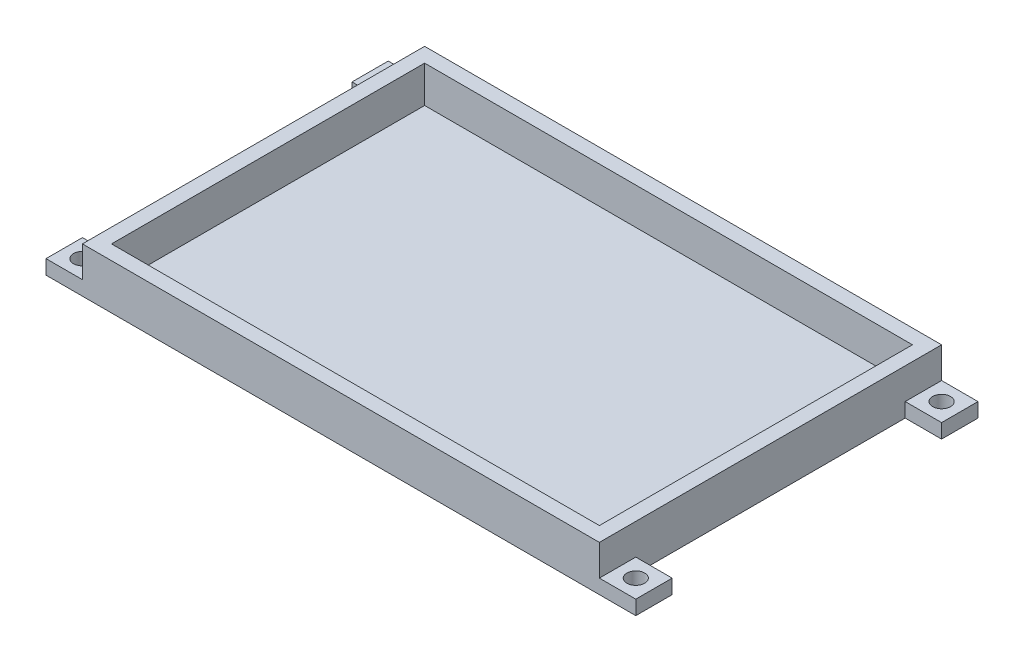
ISO-10303-21;
HEADER;
FILE_DESCRIPTION(('STEP AP214'),'2;1');
FILE_NAME('part.step','',(''),(''),'','','');
FILE_SCHEMA(('AUTOMOTIVE_DESIGN { 1 0 10303 214 1 1 1 1 }'));
ENDSEC;
DATA;
#1=APPLICATION_CONTEXT('core data for automotive mechanical design processes');
#2=APPLICATION_PROTOCOL_DEFINITION('international standard','automotive_design',2000,#1);
#3=PRODUCT_CONTEXT('',#1,'mechanical');
#4=PRODUCT('Part','Part','',(#3));
#5=PRODUCT_RELATED_PRODUCT_CATEGORY('part','',(#4));
#6=PRODUCT_DEFINITION_FORMATION('','',#4);
#7=PRODUCT_DEFINITION_CONTEXT('part definition',#1,'design');
#8=PRODUCT_DEFINITION('design','',#6,#7);
#9=PRODUCT_DEFINITION_SHAPE('','',#8);
#10=(LENGTH_UNIT() NAMED_UNIT(*) SI_UNIT(.MILLI.,.METRE.));
#11=(NAMED_UNIT(*) PLANE_ANGLE_UNIT() SI_UNIT($,.RADIAN.));
#12=(NAMED_UNIT(*) SI_UNIT($,.STERADIAN.) SOLID_ANGLE_UNIT());
#13=UNCERTAINTY_MEASURE_WITH_UNIT(LENGTH_MEASURE(1.E-05),#10,'distance_accuracy_value','');
#14=(GEOMETRIC_REPRESENTATION_CONTEXT(3) GLOBAL_UNCERTAINTY_ASSIGNED_CONTEXT((#13)) GLOBAL_UNIT_ASSIGNED_CONTEXT((#10,
#11,#12)) REPRESENTATION_CONTEXT('',''));
#15=CARTESIAN_POINT('',(0.,0.,0.));
#16=DIRECTION('',(0.,0.,1.));
#17=DIRECTION('',(1.,0.,0.));
#18=AXIS2_PLACEMENT_3D('',#15,#16,#17);
#19=CARTESIAN_POINT('',(96.5200042724609,1.5,0.));
#20=DIRECTION('',(-1.,0.,0.));
#21=DIRECTION('',(0.,0.,1.));
#22=AXIS2_PLACEMENT_3D('',#19,#20,#21);
#23=PLANE('',#22);
#24=DIRECTION('',(0.,-1.,0.));
#25=VECTOR('',#24,1.);
#26=CARTESIAN_POINT('',(96.5200042724609,2.5,6.34999942779541));
#27=LINE('',#26,#25);
#28=CARTESIAN_POINT('',(96.5200042724609,2.5,6.34999942779541));
#29=VERTEX_POINT('',#28);
#30=CARTESIAN_POINT('',(96.5200042724609,0.,6.34999942779541));
#31=VERTEX_POINT('',#30);
#32=EDGE_CURVE('E54',#29,#31,#27,.T.);
#33=ORIENTED_EDGE('',*,*,#32,.F.);
#34=DIRECTION('',(0.,0.,1.));
#35=VECTOR('',#34,1.);
#36=CARTESIAN_POINT('',(96.5200042724609,2.5,6.34999942779541));
#37=LINE('',#36,#35);
#38=CARTESIAN_POINT('',(96.5200042724609,2.5,0.));
#39=VERTEX_POINT('',#38);
#40=EDGE_CURVE('E58',#39,#29,#37,.T.);
#41=ORIENTED_EDGE('',*,*,#40,.F.);
#42=DIRECTION('',(0.,-1.,0.));
#43=VECTOR('',#42,1.);
#44=CARTESIAN_POINT('',(96.5200042724609,1.5,0.));
#45=LINE('',#44,#43);
#46=CARTESIAN_POINT('',(96.5200042724609,7.9,0.));
#47=VERTEX_POINT('',#46);
#48=EDGE_CURVE('E181',#47,#39,#45,.T.);
#49=ORIENTED_EDGE('',*,*,#48,.F.);
#50=DIRECTION('',(0.,0.,-1.));
#51=VECTOR('',#50,1.);
#52=CARTESIAN_POINT('',(96.5200042724609,7.9,0.));
#53=LINE('',#52,#51);
#54=CARTESIAN_POINT('',(96.5200042724609,7.9,59.689998626709));
#55=VERTEX_POINT('',#54);
#56=EDGE_CURVE('E327',#55,#47,#53,.T.);
#57=ORIENTED_EDGE('',*,*,#56,.F.);
#58=DIRECTION('',(0.,-1.,0.));
#59=VECTOR('',#58,1.);
#60=CARTESIAN_POINT('',(96.5200042724609,1.5,59.689998626709));
#61=LINE('',#60,#59);
#62=CARTESIAN_POINT('',(96.5200042724609,2.5,59.689998626709));
#63=VERTEX_POINT('',#62);
#64=EDGE_CURVE('E47',#55,#63,#61,.T.);
#65=ORIENTED_EDGE('',*,*,#64,.T.);
#66=DIRECTION('',(0.,0.,1.));
#67=VECTOR('',#66,1.);
#68=CARTESIAN_POINT('',(96.5200042724609,2.5,59.689998626709));
#69=LINE('',#68,#67);
#70=CARTESIAN_POINT('',(96.5200042724609,2.5,53.3400001525879));
#71=VERTEX_POINT('',#70);
#72=EDGE_CURVE('E216',#71,#63,#69,.T.);
#73=ORIENTED_EDGE('',*,*,#72,.F.);
#74=DIRECTION('',(0.,-1.,0.));
#75=VECTOR('',#74,1.);
#76=CARTESIAN_POINT('',(96.5200042724609,2.5,53.3400001525879));
#77=LINE('',#76,#75);
#78=CARTESIAN_POINT('',(96.5200042724609,0.,53.3400001525879));
#79=VERTEX_POINT('',#78);
#80=EDGE_CURVE('E226',#71,#79,#77,.T.);
#81=ORIENTED_EDGE('',*,*,#80,.T.);
#82=DIRECTION('',(0.,0.,-1.));
#83=VECTOR('',#82,1.);
#84=CARTESIAN_POINT('',(96.5200042724609,0.,0.));
#85=LINE('',#84,#83);
#86=EDGE_CURVE('E337',#79,#31,#85,.T.);
#87=ORIENTED_EDGE('',*,*,#86,.T.);
#88=EDGE_LOOP('',(#33,#41,#49,#57,#65,#73,#81,#87));
#89=FACE_BOUND('',#88,.T.);
#90=ADVANCED_FACE('F39',(#89),#23,.F.);
#91=CARTESIAN_POINT('',(6.35000038146973,1.5,0.));
#92=DIRECTION('',(1.,0.,0.));
#93=DIRECTION('',(0.,0.,-1.));
#94=AXIS2_PLACEMENT_3D('',#91,#92,#93);
#95=PLANE('',#94);
#96=DIRECTION('',(0.,-1.,0.));
#97=VECTOR('',#96,1.);
#98=CARTESIAN_POINT('',(6.35000038146973,2.5,53.3400001525879));
#99=LINE('',#98,#97);
#100=CARTESIAN_POINT('',(6.35000038146973,2.5,53.3400001525879));
#101=VERTEX_POINT('',#100);
#102=CARTESIAN_POINT('',(6.35000038146973,0.,53.3400001525879));
#103=VERTEX_POINT('',#102);
#104=EDGE_CURVE('E257',#101,#103,#99,.T.);
#105=ORIENTED_EDGE('',*,*,#104,.F.);
#106=DIRECTION('',(0.,0.,-1.));
#107=VECTOR('',#106,1.);
#108=CARTESIAN_POINT('',(6.35000038146973,2.5,53.3400001525879));
#109=LINE('',#108,#107);
#110=CARTESIAN_POINT('',(6.35000038146973,2.5,59.689998626709));
#111=VERTEX_POINT('',#110);
#112=EDGE_CURVE('E246',#111,#101,#109,.T.);
#113=ORIENTED_EDGE('',*,*,#112,.F.);
#114=DIRECTION('',(0.,-1.,0.));
#115=VECTOR('',#114,1.);
#116=CARTESIAN_POINT('',(6.35000038146973,1.5,59.689998626709));
#117=LINE('',#116,#115);
#118=CARTESIAN_POINT('',(6.35000038146973,7.9,59.689998626709));
#119=VERTEX_POINT('',#118);
#120=EDGE_CURVE('E11',#119,#111,#117,.T.);
#121=ORIENTED_EDGE('',*,*,#120,.F.);
#122=DIRECTION('',(0.,0.,1.));
#123=VECTOR('',#122,1.);
#124=CARTESIAN_POINT('',(6.35000038146973,7.9,0.));
#125=LINE('',#124,#123);
#126=CARTESIAN_POINT('',(6.35000038146973,7.9,0.));
#127=VERTEX_POINT('',#126);
#128=EDGE_CURVE('E321',#127,#119,#125,.T.);
#129=ORIENTED_EDGE('',*,*,#128,.F.);
#130=DIRECTION('',(0.,-1.,0.));
#131=VECTOR('',#130,1.);
#132=CARTESIAN_POINT('',(6.35000038146973,1.5,0.));
#133=LINE('',#132,#131);
#134=CARTESIAN_POINT('',(6.35000038146973,2.5,0.));
#135=VERTEX_POINT('',#134);
#136=EDGE_CURVE('E341',#127,#135,#133,.T.);
#137=ORIENTED_EDGE('',*,*,#136,.T.);
#138=DIRECTION('',(0.,0.,-1.));
#139=VECTOR('',#138,1.);
#140=CARTESIAN_POINT('',(6.35000038146973,2.5,0.));
#141=LINE('',#140,#139);
#142=CARTESIAN_POINT('',(6.35000038146973,2.5,6.31504575706069));
#143=VERTEX_POINT('',#142);
#144=EDGE_CURVE('E276',#143,#135,#141,.T.);
#145=ORIENTED_EDGE('',*,*,#144,.F.);
#146=DIRECTION('',(0.,-1.,0.));
#147=VECTOR('',#146,1.);
#148=CARTESIAN_POINT('',(6.35000038146973,2.5,6.31504575706069));
#149=LINE('',#148,#147);
#150=CARTESIAN_POINT('',(6.35000038146973,0.,6.31504575706069));
#151=VERTEX_POINT('',#150);
#152=EDGE_CURVE('E286',#143,#151,#149,.T.);
#153=ORIENTED_EDGE('',*,*,#152,.T.);
#154=DIRECTION('',(0.,0.,1.));
#155=VECTOR('',#154,1.);
#156=CARTESIAN_POINT('',(6.35000038146973,0.,0.));
#157=LINE('',#156,#155);
#158=EDGE_CURVE('E333',#151,#103,#157,.T.);
#159=ORIENTED_EDGE('',*,*,#158,.T.);
#160=EDGE_LOOP('',(#105,#113,#121,#129,#137,#145,#153,#159));
#161=FACE_BOUND('',#160,.T.);
#162=ADVANCED_FACE('F41',(#161),#95,.F.);
#163=CARTESIAN_POINT('',(6.35000038146973,1.5,59.689998626709));
#164=DIRECTION('',(0.,0.,-1.));
#165=DIRECTION('',(-1.,0.,0.));
#166=AXIS2_PLACEMENT_3D('',#163,#164,#165);
#167=PLANE('',#166);
#168=DIRECTION('',(1.,0.,0.));
#169=VECTOR('',#168,1.);
#170=CARTESIAN_POINT('',(6.35000038146973,0.,59.689998626709));
#171=LINE('',#170,#169);
#172=CARTESIAN_POINT('',(0.,0.,59.689998626709));
#173=VERTEX_POINT('',#172);
#174=CARTESIAN_POINT('',(102.870002746582,0.,59.689998626709));
#175=VERTEX_POINT('',#174);
#176=EDGE_CURVE('E335',#173,#175,#171,.T.);
#177=ORIENTED_EDGE('',*,*,#176,.T.);
#178=DIRECTION('',(0.,-1.,0.));
#179=VECTOR('',#178,1.);
#180=CARTESIAN_POINT('',(102.870002746582,2.5,59.689998626709));
#181=LINE('',#180,#179);
#182=CARTESIAN_POINT('',(102.870002746582,2.5,59.689998626709));
#183=VERTEX_POINT('',#182);
#184=EDGE_CURVE('E220',#183,#175,#181,.T.);
#185=ORIENTED_EDGE('',*,*,#184,.F.);
#186=DIRECTION('',(1.,0.,0.));
#187=VECTOR('',#186,1.);
#188=CARTESIAN_POINT('',(102.870002746582,2.5,59.689998626709));
#189=LINE('',#188,#187);
#190=EDGE_CURVE('E218',#63,#183,#189,.T.);
#191=ORIENTED_EDGE('',*,*,#190,.F.);
#192=ORIENTED_EDGE('',*,*,#64,.F.);
#193=DIRECTION('',(1.,0.,0.));
#194=VECTOR('',#193,1.);
#195=CARTESIAN_POINT('',(6.35000038146973,7.9,59.689998626709));
#196=LINE('',#195,#194);
#197=EDGE_CURVE('E324',#119,#55,#196,.T.);
#198=ORIENTED_EDGE('',*,*,#197,.F.);
#199=ORIENTED_EDGE('',*,*,#120,.T.);
#200=DIRECTION('',(1.,0.,0.));
#201=VECTOR('',#200,1.);
#202=CARTESIAN_POINT('',(0.,2.5,59.689998626709));
#203=LINE('',#202,#201);
#204=CARTESIAN_POINT('',(0.,2.5,59.689998626709));
#205=VERTEX_POINT('',#204);
#206=EDGE_CURVE('E242',#205,#111,#203,.T.);
#207=ORIENTED_EDGE('',*,*,#206,.F.);
#208=DIRECTION('',(0.,-1.,0.));
#209=VECTOR('',#208,1.);
#210=CARTESIAN_POINT('',(0.,2.5,59.689998626709));
#211=LINE('',#210,#209);
#212=EDGE_CURVE('E260',#205,#173,#211,.T.);
#213=ORIENTED_EDGE('',*,*,#212,.T.);
#214=EDGE_LOOP('',(#177,#185,#191,#192,#198,#199,#207,#213));
#215=FACE_BOUND('',#214,.T.);
#216=ADVANCED_FACE('F350',(#215),#167,.F.);
#217=CARTESIAN_POINT('',(6.35000038146973,1.5,0.));
#218=DIRECTION('',(0.,0.,1.));
#219=DIRECTION('',(1.,0.,0.));
#220=AXIS2_PLACEMENT_3D('',#217,#218,#219);
#221=PLANE('',#220);
#222=DIRECTION('',(-1.,0.,0.));
#223=VECTOR('',#222,1.);
#224=CARTESIAN_POINT('',(6.35000038146973,0.,0.));
#225=LINE('',#224,#223);
#226=CARTESIAN_POINT('',(102.870002746582,0.,0.));
#227=VERTEX_POINT('',#226);
#228=CARTESIAN_POINT('',(0.,0.,0.));
#229=VERTEX_POINT('',#228);
#230=EDGE_CURVE('E339',#227,#229,#225,.T.);
#231=ORIENTED_EDGE('',*,*,#230,.T.);
#232=DIRECTION('',(0.,-1.,0.));
#233=VECTOR('',#232,1.);
#234=CARTESIAN_POINT('',(0.,2.5,0.));
#235=LINE('',#234,#233);
#236=CARTESIAN_POINT('',(0.,2.5,0.));
#237=VERTEX_POINT('',#236);
#238=EDGE_CURVE('E280',#237,#229,#235,.T.);
#239=ORIENTED_EDGE('',*,*,#238,.F.);
#240=DIRECTION('',(-1.,0.,0.));
#241=VECTOR('',#240,1.);
#242=CARTESIAN_POINT('',(0.,2.5,0.));
#243=LINE('',#242,#241);
#244=EDGE_CURVE('E278',#135,#237,#243,.T.);
#245=ORIENTED_EDGE('',*,*,#244,.F.);
#246=ORIENTED_EDGE('',*,*,#136,.F.);
#247=DIRECTION('',(-1.,0.,0.));
#248=VECTOR('',#247,1.);
#249=CARTESIAN_POINT('',(6.35000038146973,7.9,0.));
#250=LINE('',#249,#248);
#251=EDGE_CURVE('E330',#47,#127,#250,.T.);
#252=ORIENTED_EDGE('',*,*,#251,.F.);
#253=ORIENTED_EDGE('',*,*,#48,.T.);
#254=DIRECTION('',(-1.,0.,0.));
#255=VECTOR('',#254,1.);
#256=CARTESIAN_POINT('',(102.870002746582,2.5,0.));
#257=LINE('',#256,#255);
#258=CARTESIAN_POINT('',(102.870002746582,2.5,0.));
#259=VERTEX_POINT('',#258);
#260=EDGE_CURVE('E174',#259,#39,#257,.T.);
#261=ORIENTED_EDGE('',*,*,#260,.F.);
#262=DIRECTION('',(0.,-1.,0.));
#263=VECTOR('',#262,1.);
#264=CARTESIAN_POINT('',(102.870002746582,2.5,0.));
#265=LINE('',#264,#263);
#266=EDGE_CURVE('E178',#259,#227,#265,.T.);
#267=ORIENTED_EDGE('',*,*,#266,.T.);
#268=EDGE_LOOP('',(#231,#239,#245,#246,#252,#253,#261,#267));
#269=FACE_BOUND('',#268,.T.);
#270=ADVANCED_FACE('F176',(#269),#221,.F.);
#271=CARTESIAN_POINT('',(0.,0.,0.));
#272=DIRECTION('',(0.,1.,0.));
#273=DIRECTION('',(0.,0.,1.));
#274=AXIS2_PLACEMENT_3D('',#271,#272,#273);
#275=PLANE('',#274);
#276=ORIENTED_EDGE('',*,*,#158,.F.);
#277=DIRECTION('',(1.,0.,0.));
#278=VECTOR('',#277,1.);
#279=CARTESIAN_POINT('',(0.,0.,6.31504575706069));
#280=LINE('',#279,#278);
#281=CARTESIAN_POINT('',(0.,0.,6.31504575706069));
#282=VERTEX_POINT('',#281);
#283=EDGE_CURVE('E274',#282,#151,#280,.T.);
#284=ORIENTED_EDGE('',*,*,#283,.F.);
#285=DIRECTION('',(0.,0.,1.));
#286=VECTOR('',#285,1.);
#287=CARTESIAN_POINT('',(0.,0.,0.));
#288=LINE('',#287,#286);
#289=EDGE_CURVE('E267',#229,#282,#288,.T.);
#290=ORIENTED_EDGE('',*,*,#289,.F.);
#291=ORIENTED_EDGE('',*,*,#230,.F.);
#292=DIRECTION('',(0.,0.,-1.));
#293=VECTOR('',#292,1.);
#294=CARTESIAN_POINT('',(102.870002746582,0.,6.34999942779541));
#295=LINE('',#294,#293);
#296=CARTESIAN_POINT('',(102.870002746582,0.,6.34999942779541));
#297=VERTEX_POINT('',#296);
#298=EDGE_CURVE('E197',#297,#227,#295,.T.);
#299=ORIENTED_EDGE('',*,*,#298,.F.);
#300=DIRECTION('',(1.,0.,0.));
#301=VECTOR('',#300,1.);
#302=CARTESIAN_POINT('',(102.870002746582,0.,6.34999942779541));
#303=LINE('',#302,#301);
#304=EDGE_CURVE('E193',#31,#297,#303,.T.);
#305=ORIENTED_EDGE('',*,*,#304,.F.);
#306=ORIENTED_EDGE('',*,*,#86,.F.);
#307=DIRECTION('',(-1.,0.,0.));
#308=VECTOR('',#307,1.);
#309=CARTESIAN_POINT('',(102.870002746582,0.,53.3400001525879));
#310=LINE('',#309,#308);
#311=CARTESIAN_POINT('',(102.870002746582,0.,53.3400001525879));
#312=VERTEX_POINT('',#311);
#313=EDGE_CURVE('E214',#312,#79,#310,.T.);
#314=ORIENTED_EDGE('',*,*,#313,.F.);
#315=DIRECTION('',(0.,0.,-1.));
#316=VECTOR('',#315,1.);
#317=CARTESIAN_POINT('',(102.870002746582,0.,59.689998626709));
#318=LINE('',#317,#316);
#319=EDGE_CURVE('E208',#175,#312,#318,.T.);
#320=ORIENTED_EDGE('',*,*,#319,.F.);
#321=ORIENTED_EDGE('',*,*,#176,.F.);
#322=DIRECTION('',(0.,0.,1.));
#323=VECTOR('',#322,1.);
#324=CARTESIAN_POINT('',(0.,0.,53.3400001525879));
#325=LINE('',#324,#323);
#326=CARTESIAN_POINT('',(0.,0.,53.3400001525879));
#327=VERTEX_POINT('',#326);
#328=EDGE_CURVE('E236',#327,#173,#325,.T.);
#329=ORIENTED_EDGE('',*,*,#328,.F.);
#330=DIRECTION('',(-1.,0.,0.));
#331=VECTOR('',#330,1.);
#332=CARTESIAN_POINT('',(0.,0.,53.3400001525879));
#333=LINE('',#332,#331);
#334=EDGE_CURVE('E243',#103,#327,#333,.T.);
#335=ORIENTED_EDGE('',*,*,#334,.F.);
#336=EDGE_LOOP('',(#276,#284,#290,#291,#299,#305,#306,#314,#320,#321,#329,#335));
#337=FACE_BOUND('',#336,.T.);
#338=CARTESIAN_POINT('',(3.17569082859028,0.,3.17674299040357));
#339=DIRECTION('',(0.,1.,0.));
#340=DIRECTION('',(0.,0.,1.));
#341=AXIS2_PLACEMENT_3D('',#338,#339,#340);
#342=CIRCLE('',#341,1.54899571040419);
#343=CARTESIAN_POINT('',(3.17569082859028,0.,4.72573870080776));
#344=VERTEX_POINT('',#343);
#345=EDGE_CURVE('E263',#344,#344,#342,.T.);
#346=ORIENTED_EDGE('',*,*,#345,.T.);
#347=EDGE_LOOP('',(#346));
#348=FACE_BOUND('',#347,.T.);
#349=CARTESIAN_POINT('',(3.1750006865792,0.,56.5149994240325));
#350=DIRECTION('',(0.,1.,0.));
#351=DIRECTION('',(0.,0.,1.));
#352=AXIS2_PLACEMENT_3D('',#349,#350,#351);
#353=CIRCLE('',#352,1.55000058232346);
#354=CARTESIAN_POINT('',(3.1750006865792,0.,58.0650000063559));
#355=VERTEX_POINT('',#354);
#356=EDGE_CURVE('E232',#355,#355,#353,.T.);
#357=ORIENTED_EDGE('',*,*,#356,.T.);
#358=EDGE_LOOP('',(#357));
#359=FACE_BOUND('',#358,.T.);
#360=CARTESIAN_POINT('',(99.6950007246688,0.,56.5149975000025));
#361=DIRECTION('',(0.,1.,0.));
#362=DIRECTION('',(0.,0.,1.));
#363=AXIS2_PLACEMENT_3D('',#360,#361,#362);
#364=CIRCLE('',#363,1.55000006825485);
#365=CARTESIAN_POINT('',(99.6950007246688,0.,58.0649975682573));
#366=VERTEX_POINT('',#365);
#367=EDGE_CURVE('E198',#366,#366,#364,.T.);
#368=ORIENTED_EDGE('',*,*,#367,.T.);
#369=EDGE_LOOP('',(#368));
#370=FACE_BOUND('',#369,.T.);
#371=CARTESIAN_POINT('',(99.6949996948242,0.,3.17499670702634));
#372=DIRECTION('',(0.,1.,0.));
#373=DIRECTION('',(0.,0.,1.));
#374=AXIS2_PLACEMENT_3D('',#371,#372,#373);
#375=CIRCLE('',#374,1.54999958863765);
#376=CARTESIAN_POINT('',(99.6949996948242,0.,4.72499629566399));
#377=VERTEX_POINT('',#376);
#378=EDGE_CURVE('E401',#377,#377,#375,.T.);
#379=ORIENTED_EDGE('',*,*,#378,.T.);
#380=EDGE_LOOP('',(#379));
#381=FACE_BOUND('',#380,.T.);
#382=ADVANCED_FACE('F375',(#337,#348,#359,#370,#381),#275,.F.);
#383=CARTESIAN_POINT('',(0.,7.9,0.));
#384=DIRECTION('',(0.,1.,0.));
#385=DIRECTION('',(0.,0.,1.));
#386=AXIS2_PLACEMENT_3D('',#383,#384,#385);
#387=PLANE('',#386);
#388=ORIENTED_EDGE('',*,*,#128,.T.);
#389=ORIENTED_EDGE('',*,*,#197,.T.);
#390=ORIENTED_EDGE('',*,*,#56,.T.);
#391=ORIENTED_EDGE('',*,*,#251,.T.);
#392=EDGE_LOOP('',(#388,#389,#390,#391));
#393=FACE_BOUND('',#392,.T.);
#394=DIRECTION('',(-1.,0.,0.));
#395=VECTOR('',#394,1.);
#396=CARTESIAN_POINT('',(93.9799957275391,7.9,2.53999972343445));
#397=LINE('',#396,#395);
#398=CARTESIAN_POINT('',(93.9799957275391,7.9,2.53999972343445));
#399=VERTEX_POINT('',#398);
#400=CARTESIAN_POINT('',(8.89000034332275,7.9,2.53999972343445));
#401=VERTEX_POINT('',#400);
#402=EDGE_CURVE('E295',#399,#401,#397,.T.);
#403=ORIENTED_EDGE('',*,*,#402,.F.);
#404=DIRECTION('',(0.,0.,-1.));
#405=VECTOR('',#404,1.);
#406=CARTESIAN_POINT('',(93.9799957275391,7.9,57.1499977111816));
#407=LINE('',#406,#405);
#408=CARTESIAN_POINT('',(93.9799957275391,7.9,57.1499977111816));
#409=VERTEX_POINT('',#408);
#410=EDGE_CURVE('E293',#409,#399,#407,.T.);
#411=ORIENTED_EDGE('',*,*,#410,.F.);
#412=DIRECTION('',(1.,0.,0.));
#413=VECTOR('',#412,1.);
#414=CARTESIAN_POINT('',(93.9799957275391,7.9,57.1499977111816));
#415=LINE('',#414,#413);
#416=CARTESIAN_POINT('',(8.89000034332275,7.9,57.1499977111816));
#417=VERTEX_POINT('',#416);
#418=EDGE_CURVE('E301',#417,#409,#415,.T.);
#419=ORIENTED_EDGE('',*,*,#418,.F.);
#420=DIRECTION('',(0.,0.,1.));
#421=VECTOR('',#420,1.);
#422=CARTESIAN_POINT('',(8.89000034332275,7.9,57.1499977111816));
#423=LINE('',#422,#421);
#424=EDGE_CURVE('E298',#401,#417,#423,.T.);
#425=ORIENTED_EDGE('',*,*,#424,.F.);
#426=EDGE_LOOP('',(#403,#411,#419,#425));
#427=FACE_BOUND('',#426,.T.);
#428=ADVANCED_FACE('F353',(#393,#427),#387,.T.);
#429=CARTESIAN_POINT('',(93.9799957275391,7.9,57.1499977111816));
#430=DIRECTION('',(-1.,0.,0.));
#431=DIRECTION('',(0.,0.,1.));
#432=AXIS2_PLACEMENT_3D('',#429,#430,#431);
#433=PLANE('',#432);
#434=DIRECTION('',(0.,0.,-1.));
#435=VECTOR('',#434,1.);
#436=CARTESIAN_POINT('',(93.9799957275391,1.5,57.1499977111816));
#437=LINE('',#436,#435);
#438=CARTESIAN_POINT('',(93.9799957275391,1.5,57.1499977111816));
#439=VERTEX_POINT('',#438);
#440=CARTESIAN_POINT('',(93.9799957275391,1.5,2.53999972343445));
#441=VERTEX_POINT('',#440);
#442=EDGE_CURVE('E292',#439,#441,#437,.T.);
#443=ORIENTED_EDGE('',*,*,#442,.F.);
#444=DIRECTION('',(0.,-1.,0.));
#445=VECTOR('',#444,1.);
#446=CARTESIAN_POINT('',(93.9799957275391,7.9,57.1499977111816));
#447=LINE('',#446,#445);
#448=EDGE_CURVE('E303',#409,#439,#447,.T.);
#449=ORIENTED_EDGE('',*,*,#448,.F.);
#450=ORIENTED_EDGE('',*,*,#410,.T.);
#451=DIRECTION('',(0.,-1.,0.));
#452=VECTOR('',#451,1.);
#453=CARTESIAN_POINT('',(93.9799957275391,7.9,2.53999972343445));
#454=LINE('',#453,#452);
#455=EDGE_CURVE('E318',#399,#441,#454,.T.);
#456=ORIENTED_EDGE('',*,*,#455,.T.);
#457=EDGE_LOOP('',(#443,#449,#450,#456));
#458=FACE_BOUND('',#457,.T.);
#459=ADVANCED_FACE('F480',(#458),#433,.T.);
#460=CARTESIAN_POINT('',(93.9799957275391,7.9,2.53999972343445));
#461=DIRECTION('',(0.,0.,1.));
#462=DIRECTION('',(1.,0.,0.));
#463=AXIS2_PLACEMENT_3D('',#460,#461,#462);
#464=PLANE('',#463);
#465=DIRECTION('',(-1.,0.,0.));
#466=VECTOR('',#465,1.);
#467=CARTESIAN_POINT('',(93.9799957275391,1.5,2.53999972343445));
#468=LINE('',#467,#466);
#469=CARTESIAN_POINT('',(8.89000034332275,1.5,2.53999972343445));
#470=VERTEX_POINT('',#469);
#471=EDGE_CURVE('E305',#441,#470,#468,.T.);
#472=ORIENTED_EDGE('',*,*,#471,.F.);
#473=ORIENTED_EDGE('',*,*,#455,.F.);
#474=ORIENTED_EDGE('',*,*,#402,.T.);
#475=DIRECTION('',(0.,-1.,0.));
#476=VECTOR('',#475,1.);
#477=CARTESIAN_POINT('',(8.89000034332275,7.9,2.53999972343445));
#478=LINE('',#477,#476);
#479=EDGE_CURVE('E315',#401,#470,#478,.T.);
#480=ORIENTED_EDGE('',*,*,#479,.T.);
#481=EDGE_LOOP('',(#472,#473,#474,#480));
#482=FACE_BOUND('',#481,.T.);
#483=ADVANCED_FACE('F488',(#482),#464,.T.);
#484=CARTESIAN_POINT('',(8.89000034332275,7.9,57.1499977111816));
#485=DIRECTION('',(1.,0.,0.));
#486=DIRECTION('',(0.,0.,-1.));
#487=AXIS2_PLACEMENT_3D('',#484,#485,#486);
#488=PLANE('',#487);
#489=DIRECTION('',(0.,0.,1.));
#490=VECTOR('',#489,1.);
#491=CARTESIAN_POINT('',(8.89000034332275,1.5,57.1499977111816));
#492=LINE('',#491,#490);
#493=CARTESIAN_POINT('',(8.89000034332275,1.5,57.1499977111816));
#494=VERTEX_POINT('',#493);
#495=EDGE_CURVE('E307',#470,#494,#492,.T.);
#496=ORIENTED_EDGE('',*,*,#495,.F.);
#497=ORIENTED_EDGE('',*,*,#479,.F.);
#498=ORIENTED_EDGE('',*,*,#424,.T.);
#499=DIRECTION('',(0.,-1.,0.));
#500=VECTOR('',#499,1.);
#501=CARTESIAN_POINT('',(8.89000034332275,7.9,57.1499977111816));
#502=LINE('',#501,#500);
#503=EDGE_CURVE('E312',#417,#494,#502,.T.);
#504=ORIENTED_EDGE('',*,*,#503,.T.);
#505=EDGE_LOOP('',(#496,#497,#498,#504));
#506=FACE_BOUND('',#505,.T.);
#507=ADVANCED_FACE('F496',(#506),#488,.T.);
#508=CARTESIAN_POINT('',(93.9799957275391,7.9,57.1499977111816));
#509=DIRECTION('',(0.,0.,-1.));
#510=DIRECTION('',(-1.,0.,0.));
#511=AXIS2_PLACEMENT_3D('',#508,#509,#510);
#512=PLANE('',#511);
#513=DIRECTION('',(1.,0.,0.));
#514=VECTOR('',#513,1.);
#515=CARTESIAN_POINT('',(93.9799957275391,1.5,57.1499977111816));
#516=LINE('',#515,#514);
#517=EDGE_CURVE('E296',#494,#439,#516,.T.);
#518=ORIENTED_EDGE('',*,*,#517,.F.);
#519=ORIENTED_EDGE('',*,*,#503,.F.);
#520=ORIENTED_EDGE('',*,*,#418,.T.);
#521=ORIENTED_EDGE('',*,*,#448,.T.);
#522=EDGE_LOOP('',(#518,#519,#520,#521));
#523=FACE_BOUND('',#522,.T.);
#524=ADVANCED_FACE('F504',(#523),#512,.T.);
#525=CARTESIAN_POINT('',(0.,1.5,0.));
#526=DIRECTION('',(0.,1.,0.));
#527=DIRECTION('',(0.,0.,1.));
#528=AXIS2_PLACEMENT_3D('',#525,#526,#527);
#529=PLANE('',#528);
#530=ORIENTED_EDGE('',*,*,#442,.T.);
#531=ORIENTED_EDGE('',*,*,#471,.T.);
#532=ORIENTED_EDGE('',*,*,#495,.T.);
#533=ORIENTED_EDGE('',*,*,#517,.T.);
#534=EDGE_LOOP('',(#530,#531,#532,#533));
#535=FACE_BOUND('',#534,.T.);
#536=ADVANCED_FACE('F512',(#535),#529,.T.);
#537=CARTESIAN_POINT('',(0.,2.5,0.));
#538=DIRECTION('',(0.,1.,0.));
#539=DIRECTION('',(0.,0.,1.));
#540=AXIS2_PLACEMENT_3D('',#537,#538,#539);
#541=PLANE('',#540);
#542=DIRECTION('',(0.,0.,1.));
#543=VECTOR('',#542,1.);
#544=CARTESIAN_POINT('',(0.,2.5,0.));
#545=LINE('',#544,#543);
#546=CARTESIAN_POINT('',(0.,2.5,6.31504575706069));
#547=VERTEX_POINT('',#546);
#548=EDGE_CURVE('E270',#237,#547,#545,.T.);
#549=ORIENTED_EDGE('',*,*,#548,.T.);
#550=DIRECTION('',(1.,0.,0.));
#551=VECTOR('',#550,1.);
#552=CARTESIAN_POINT('',(0.,2.5,6.31504575706069));
#553=LINE('',#552,#551);
#554=EDGE_CURVE('E273',#547,#143,#553,.T.);
#555=ORIENTED_EDGE('',*,*,#554,.T.);
#556=ORIENTED_EDGE('',*,*,#144,.T.);
#557=ORIENTED_EDGE('',*,*,#244,.T.);
#558=EDGE_LOOP('',(#549,#555,#556,#557));
#559=FACE_BOUND('',#558,.T.);
#560=CARTESIAN_POINT('',(3.17569082859028,2.5,3.17674299040357));
#561=DIRECTION('',(0.,1.,0.));
#562=DIRECTION('',(0.,0.,1.));
#563=AXIS2_PLACEMENT_3D('',#560,#561,#562);
#564=CIRCLE('',#563,1.54899571040419);
#565=CARTESIAN_POINT('',(3.17569082859028,2.5,4.72573870080776));
#566=VERTEX_POINT('',#565);
#567=EDGE_CURVE('E264',#566,#566,#564,.T.);
#568=ORIENTED_EDGE('',*,*,#567,.F.);
#569=EDGE_LOOP('',(#568));
#570=FACE_BOUND('',#569,.T.);
#571=ADVANCED_FACE('F420',(#559,#570),#541,.T.);
#572=CARTESIAN_POINT('',(0.,2.5,0.));
#573=DIRECTION('',(1.,0.,0.));
#574=DIRECTION('',(0.,0.,-1.));
#575=AXIS2_PLACEMENT_3D('',#572,#573,#574);
#576=PLANE('',#575);
#577=ORIENTED_EDGE('',*,*,#289,.T.);
#578=DIRECTION('',(0.,-1.,0.));
#579=VECTOR('',#578,1.);
#580=CARTESIAN_POINT('',(0.,2.5,6.31504575706069));
#581=LINE('',#580,#579);
#582=EDGE_CURVE('E289',#547,#282,#581,.T.);
#583=ORIENTED_EDGE('',*,*,#582,.F.);
#584=ORIENTED_EDGE('',*,*,#548,.F.);
#585=ORIENTED_EDGE('',*,*,#238,.T.);
#586=EDGE_LOOP('',(#577,#583,#584,#585));
#587=FACE_BOUND('',#586,.T.);
#588=ADVANCED_FACE('F417',(#587),#576,.F.);
#589=CARTESIAN_POINT('',(0.,2.5,6.31504575706069));
#590=DIRECTION('',(0.,0.,-1.));
#591=DIRECTION('',(-1.,0.,0.));
#592=AXIS2_PLACEMENT_3D('',#589,#590,#591);
#593=PLANE('',#592);
#594=ORIENTED_EDGE('',*,*,#283,.T.);
#595=ORIENTED_EDGE('',*,*,#152,.F.);
#596=ORIENTED_EDGE('',*,*,#554,.F.);
#597=ORIENTED_EDGE('',*,*,#582,.T.);
#598=EDGE_LOOP('',(#594,#595,#596,#597));
#599=FACE_BOUND('',#598,.T.);
#600=ADVANCED_FACE('F533',(#599),#593,.F.);
#601=CARTESIAN_POINT('',(3.17569082859028,2.5,3.17674299040357));
#602=DIRECTION('',(0.,-1.,0.));
#603=DIRECTION('',(0.,0.,-1.));
#604=AXIS2_PLACEMENT_3D('',#601,#602,#603);
#605=CYLINDRICAL_SURFACE('',#604,1.54899571040419);
#606=ORIENTED_EDGE('',*,*,#567,.T.);
#607=EDGE_LOOP('',(#606));
#608=FACE_BOUND('',#607,.T.);
#609=ORIENTED_EDGE('',*,*,#345,.F.);
#610=EDGE_LOOP('',(#609));
#611=FACE_BOUND('',#610,.T.);
#612=ADVANCED_FACE('F540',(#608,#611),#605,.F.);
#613=CARTESIAN_POINT('',(0.,2.5,0.));
#614=DIRECTION('',(0.,1.,0.));
#615=DIRECTION('',(0.,0.,1.));
#616=AXIS2_PLACEMENT_3D('',#613,#614,#615);
#617=PLANE('',#616);
#618=DIRECTION('',(0.,0.,1.));
#619=VECTOR('',#618,1.);
#620=CARTESIAN_POINT('',(0.,2.5,53.3400001525879));
#621=LINE('',#620,#619);
#622=CARTESIAN_POINT('',(0.,2.5,53.3400001525879));
#623=VERTEX_POINT('',#622);
#624=EDGE_CURVE('E239',#623,#205,#621,.T.);
#625=ORIENTED_EDGE('',*,*,#624,.T.);
#626=ORIENTED_EDGE('',*,*,#206,.T.);
#627=ORIENTED_EDGE('',*,*,#112,.T.);
#628=DIRECTION('',(-1.,0.,0.));
#629=VECTOR('',#628,1.);
#630=CARTESIAN_POINT('',(0.,2.5,53.3400001525879));
#631=LINE('',#630,#629);
#632=EDGE_CURVE('E249',#101,#623,#631,.T.);
#633=ORIENTED_EDGE('',*,*,#632,.T.);
#634=EDGE_LOOP('',(#625,#626,#627,#633));
#635=FACE_BOUND('',#634,.T.);
#636=CARTESIAN_POINT('',(3.1750006865792,2.5,56.5149994240325));
#637=DIRECTION('',(0.,1.,0.));
#638=DIRECTION('',(0.,0.,1.));
#639=AXIS2_PLACEMENT_3D('',#636,#637,#638);
#640=CIRCLE('',#639,1.55000058232346);
#641=CARTESIAN_POINT('',(3.1750006865792,2.5,58.0650000063559));
#642=VERTEX_POINT('',#641);
#643=EDGE_CURVE('E233',#642,#642,#640,.T.);
#644=ORIENTED_EDGE('',*,*,#643,.F.);
#645=EDGE_LOOP('',(#644));
#646=FACE_BOUND('',#645,.T.);
#647=ADVANCED_FACE('F359',(#635,#646),#617,.T.);
#648=CARTESIAN_POINT('',(0.,2.5,53.3400001525879));
#649=DIRECTION('',(1.,0.,0.));
#650=DIRECTION('',(0.,0.,-1.));
#651=AXIS2_PLACEMENT_3D('',#648,#649,#650);
#652=PLANE('',#651);
#653=ORIENTED_EDGE('',*,*,#328,.T.);
#654=ORIENTED_EDGE('',*,*,#212,.F.);
#655=ORIENTED_EDGE('',*,*,#624,.F.);
#656=DIRECTION('',(0.,-1.,0.));
#657=VECTOR('',#656,1.);
#658=CARTESIAN_POINT('',(0.,2.5,53.3400001525879));
#659=LINE('',#658,#657);
#660=EDGE_CURVE('E251',#623,#327,#659,.T.);
#661=ORIENTED_EDGE('',*,*,#660,.T.);
#662=EDGE_LOOP('',(#653,#654,#655,#661));
#663=FACE_BOUND('',#662,.T.);
#664=ADVANCED_FACE('F366',(#663),#652,.F.);
#665=CARTESIAN_POINT('',(0.,2.5,53.3400001525879));
#666=DIRECTION('',(0.,0.,1.));
#667=DIRECTION('',(1.,0.,0.));
#668=AXIS2_PLACEMENT_3D('',#665,#666,#667);
#669=PLANE('',#668);
#670=ORIENTED_EDGE('',*,*,#334,.T.);
#671=ORIENTED_EDGE('',*,*,#660,.F.);
#672=ORIENTED_EDGE('',*,*,#632,.F.);
#673=ORIENTED_EDGE('',*,*,#104,.T.);
#674=EDGE_LOOP('',(#670,#671,#672,#673));
#675=FACE_BOUND('',#674,.T.);
#676=ADVANCED_FACE('F426',(#675),#669,.F.);
#677=CARTESIAN_POINT('',(3.1750006865792,2.5,56.5149994240325));
#678=DIRECTION('',(0.,-1.,0.));
#679=DIRECTION('',(0.,0.,-1.));
#680=AXIS2_PLACEMENT_3D('',#677,#678,#679);
#681=CYLINDRICAL_SURFACE('',#680,1.55000058232346);
#682=ORIENTED_EDGE('',*,*,#643,.T.);
#683=EDGE_LOOP('',(#682));
#684=FACE_BOUND('',#683,.T.);
#685=ORIENTED_EDGE('',*,*,#356,.F.);
#686=EDGE_LOOP('',(#685));
#687=FACE_BOUND('',#686,.T.);
#688=ADVANCED_FACE('F386',(#684,#687),#681,.F.);
#689=CARTESIAN_POINT('',(0.,2.5,0.));
#690=DIRECTION('',(0.,1.,0.));
#691=DIRECTION('',(0.,0.,1.));
#692=AXIS2_PLACEMENT_3D('',#689,#690,#691);
#693=PLANE('',#692);
#694=DIRECTION('',(0.,0.,-1.));
#695=VECTOR('',#694,1.);
#696=CARTESIAN_POINT('',(102.870002746582,2.5,59.689998626709));
#697=LINE('',#696,#695);
#698=CARTESIAN_POINT('',(102.870002746582,2.5,53.3400001525879));
#699=VERTEX_POINT('',#698);
#700=EDGE_CURVE('E210',#183,#699,#697,.T.);
#701=ORIENTED_EDGE('',*,*,#700,.T.);
#702=DIRECTION('',(-1.,0.,0.));
#703=VECTOR('',#702,1.);
#704=CARTESIAN_POINT('',(102.870002746582,2.5,53.3400001525879));
#705=LINE('',#704,#703);
#706=EDGE_CURVE('E213',#699,#71,#705,.T.);
#707=ORIENTED_EDGE('',*,*,#706,.T.);
#708=ORIENTED_EDGE('',*,*,#72,.T.);
#709=ORIENTED_EDGE('',*,*,#190,.T.);
#710=EDGE_LOOP('',(#701,#707,#708,#709));
#711=FACE_BOUND('',#710,.T.);
#712=CARTESIAN_POINT('',(99.6950007246688,2.5,56.5149975000025));
#713=DIRECTION('',(0.,1.,0.));
#714=DIRECTION('',(0.,0.,1.));
#715=AXIS2_PLACEMENT_3D('',#712,#713,#714);
#716=CIRCLE('',#715,1.55000006825485);
#717=CARTESIAN_POINT('',(99.6950007246688,2.5,58.0649975682573));
#718=VERTEX_POINT('',#717);
#719=EDGE_CURVE('E201',#718,#718,#716,.T.);
#720=ORIENTED_EDGE('',*,*,#719,.F.);
#721=EDGE_LOOP('',(#720));
#722=FACE_BOUND('',#721,.T.);
#723=ADVANCED_FACE('F383',(#711,#722),#693,.T.);
#724=CARTESIAN_POINT('',(102.870002746582,2.5,59.689998626709));
#725=DIRECTION('',(-1.,0.,0.));
#726=DIRECTION('',(0.,0.,1.));
#727=AXIS2_PLACEMENT_3D('',#724,#725,#726);
#728=PLANE('',#727);
#729=ORIENTED_EDGE('',*,*,#319,.T.);
#730=DIRECTION('',(0.,-1.,0.));
#731=VECTOR('',#730,1.);
#732=CARTESIAN_POINT('',(102.870002746582,2.5,53.3400001525879));
#733=LINE('',#732,#731);
#734=EDGE_CURVE('E229',#699,#312,#733,.T.);
#735=ORIENTED_EDGE('',*,*,#734,.F.);
#736=ORIENTED_EDGE('',*,*,#700,.F.);
#737=ORIENTED_EDGE('',*,*,#184,.T.);
#738=EDGE_LOOP('',(#729,#735,#736,#737));
#739=FACE_BOUND('',#738,.T.);
#740=ADVANCED_FACE('F372',(#739),#728,.F.);
#741=CARTESIAN_POINT('',(102.870002746582,2.5,53.3400001525879));
#742=DIRECTION('',(0.,0.,1.));
#743=DIRECTION('',(1.,0.,0.));
#744=AXIS2_PLACEMENT_3D('',#741,#742,#743);
#745=PLANE('',#744);
#746=ORIENTED_EDGE('',*,*,#313,.T.);
#747=ORIENTED_EDGE('',*,*,#80,.F.);
#748=ORIENTED_EDGE('',*,*,#706,.F.);
#749=ORIENTED_EDGE('',*,*,#734,.T.);
#750=EDGE_LOOP('',(#746,#747,#748,#749));
#751=FACE_BOUND('',#750,.T.);
#752=ADVANCED_FACE('F381',(#751),#745,.F.);
#753=CARTESIAN_POINT('',(99.6950007246688,2.5,56.5149975000025));
#754=DIRECTION('',(0.,-1.,0.));
#755=DIRECTION('',(0.,0.,-1.));
#756=AXIS2_PLACEMENT_3D('',#753,#754,#755);
#757=CYLINDRICAL_SURFACE('',#756,1.55000006825485);
#758=ORIENTED_EDGE('',*,*,#719,.T.);
#759=EDGE_LOOP('',(#758));
#760=FACE_BOUND('',#759,.T.);
#761=ORIENTED_EDGE('',*,*,#367,.F.);
#762=EDGE_LOOP('',(#761));
#763=FACE_BOUND('',#762,.T.);
#764=ADVANCED_FACE('F390',(#760,#763),#757,.F.);
#765=CARTESIAN_POINT('',(0.,2.5,0.));
#766=DIRECTION('',(0.,1.,0.));
#767=DIRECTION('',(0.,0.,1.));
#768=AXIS2_PLACEMENT_3D('',#765,#766,#767);
#769=PLANE('',#768);
#770=DIRECTION('',(0.,0.,-1.));
#771=VECTOR('',#770,1.);
#772=CARTESIAN_POINT('',(102.870002746582,2.5,6.34999942779541));
#773=LINE('',#772,#771);
#774=CARTESIAN_POINT('',(102.870002746582,2.5,6.34999942779541));
#775=VERTEX_POINT('',#774);
#776=EDGE_CURVE('E183',#775,#259,#773,.T.);
#777=ORIENTED_EDGE('',*,*,#776,.T.);
#778=ORIENTED_EDGE('',*,*,#260,.T.);
#779=ORIENTED_EDGE('',*,*,#40,.T.);
#780=DIRECTION('',(1.,0.,0.));
#781=VECTOR('',#780,1.);
#782=CARTESIAN_POINT('',(102.870002746582,2.5,6.34999942779541));
#783=LINE('',#782,#781);
#784=EDGE_CURVE('E189',#29,#775,#783,.T.);
#785=ORIENTED_EDGE('',*,*,#784,.T.);
#786=EDGE_LOOP('',(#777,#778,#779,#785));
#787=FACE_BOUND('',#786,.T.);
#788=CARTESIAN_POINT('',(99.6949996948242,2.5,3.17499670702634));
#789=DIRECTION('',(0.,1.,0.));
#790=DIRECTION('',(0.,0.,1.));
#791=AXIS2_PLACEMENT_3D('',#788,#789,#790);
#792=CIRCLE('',#791,1.54999958863765);
#793=CARTESIAN_POINT('',(99.6949996948242,2.5,4.72499629566399));
#794=VERTEX_POINT('',#793);
#795=EDGE_CURVE('E403',#794,#794,#792,.T.);
#796=ORIENTED_EDGE('',*,*,#795,.F.);
#797=EDGE_LOOP('',(#796));
#798=FACE_BOUND('',#797,.T.);
#799=ADVANCED_FACE('F186',(#787,#798),#769,.T.);
#800=CARTESIAN_POINT('',(102.870002746582,2.5,6.34999942779541));
#801=DIRECTION('',(-1.,0.,0.));
#802=DIRECTION('',(0.,0.,1.));
#803=AXIS2_PLACEMENT_3D('',#800,#801,#802);
#804=PLANE('',#803);
#805=ORIENTED_EDGE('',*,*,#298,.T.);
#806=ORIENTED_EDGE('',*,*,#266,.F.);
#807=ORIENTED_EDGE('',*,*,#776,.F.);
#808=DIRECTION('',(0.,-1.,0.));
#809=VECTOR('',#808,1.);
#810=CARTESIAN_POINT('',(102.870002746582,2.5,6.34999942779541));
#811=LINE('',#810,#809);
#812=EDGE_CURVE('E203',#775,#297,#811,.T.);
#813=ORIENTED_EDGE('',*,*,#812,.T.);
#814=EDGE_LOOP('',(#805,#806,#807,#813));
#815=FACE_BOUND('',#814,.T.);
#816=ADVANCED_FACE('F195',(#815),#804,.F.);
#817=CARTESIAN_POINT('',(102.870002746582,2.5,6.34999942779541));
#818=DIRECTION('',(0.,0.,-1.));
#819=DIRECTION('',(-1.,0.,0.));
#820=AXIS2_PLACEMENT_3D('',#817,#818,#819);
#821=PLANE('',#820);
#822=ORIENTED_EDGE('',*,*,#304,.T.);
#823=ORIENTED_EDGE('',*,*,#812,.F.);
#824=ORIENTED_EDGE('',*,*,#784,.F.);
#825=ORIENTED_EDGE('',*,*,#32,.T.);
#826=EDGE_LOOP('',(#822,#823,#824,#825));
#827=FACE_BOUND('',#826,.T.);
#828=ADVANCED_FACE('F618',(#827),#821,.F.);
#829=CARTESIAN_POINT('',(99.6949996948242,2.5,3.17499670702634));
#830=DIRECTION('',(0.,-1.,0.));
#831=DIRECTION('',(0.,0.,-1.));
#832=AXIS2_PLACEMENT_3D('',#829,#830,#831);
#833=CYLINDRICAL_SURFACE('',#832,1.54999958863765);
#834=ORIENTED_EDGE('',*,*,#795,.T.);
#835=EDGE_LOOP('',(#834));
#836=FACE_BOUND('',#835,.T.);
#837=ORIENTED_EDGE('',*,*,#378,.F.);
#838=EDGE_LOOP('',(#837));
#839=FACE_BOUND('',#838,.T.);
#840=ADVANCED_FACE('F625',(#836,#839),#833,.F.);
#841=CLOSED_SHELL('',(#90,#162,#216,#270,#382,#428,#459,#483,#507,#524,#536,#571,#588,#600,#612,
#647,#664,#676,#688,#723,#740,#752,#764,#799,#816,#828,#840));
#842=MANIFOLD_SOLID_BREP('B2',#841);
#843=ADVANCED_BREP_SHAPE_REPRESENTATION('',(#18,#842),#14);
#844=SHAPE_DEFINITION_REPRESENTATION(#9,#843);
ENDSEC;
END-ISO-10303-21;
